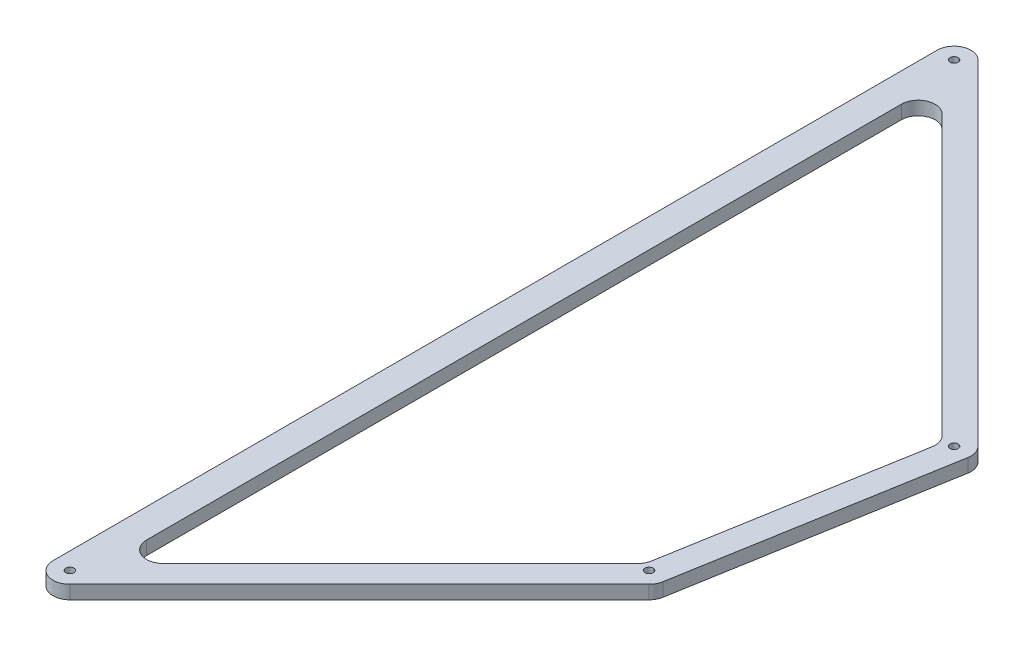
ISO-10303-21;
HEADER;
FILE_DESCRIPTION(('STEP AP214'),'2;1');
FILE_NAME('part.step','',(''),(''),'','','');
FILE_SCHEMA(('AUTOMOTIVE_DESIGN { 1 0 10303 214 1 1 1 1 }'));
ENDSEC;
DATA;
#1=APPLICATION_CONTEXT('core data for automotive mechanical design processes');
#2=APPLICATION_PROTOCOL_DEFINITION('international standard','automotive_design',2000,#1);
#3=PRODUCT_CONTEXT('',#1,'mechanical');
#4=PRODUCT('Part','Part','',(#3));
#5=PRODUCT_RELATED_PRODUCT_CATEGORY('part','',(#4));
#6=PRODUCT_DEFINITION_FORMATION('','',#4);
#7=PRODUCT_DEFINITION_CONTEXT('part definition',#1,'design');
#8=PRODUCT_DEFINITION('design','',#6,#7);
#9=PRODUCT_DEFINITION_SHAPE('','',#8);
#10=(LENGTH_UNIT() NAMED_UNIT(*) SI_UNIT(.MILLI.,.METRE.));
#11=(NAMED_UNIT(*) PLANE_ANGLE_UNIT() SI_UNIT($,.RADIAN.));
#12=(NAMED_UNIT(*) SI_UNIT($,.STERADIAN.) SOLID_ANGLE_UNIT());
#13=UNCERTAINTY_MEASURE_WITH_UNIT(LENGTH_MEASURE(1.E-05),#10,'distance_accuracy_value','');
#14=(GEOMETRIC_REPRESENTATION_CONTEXT(3) GLOBAL_UNCERTAINTY_ASSIGNED_CONTEXT((#13)) GLOBAL_UNIT_ASSIGNED_CONTEXT((#10,
#11,#12)) REPRESENTATION_CONTEXT('',''));
#15=CARTESIAN_POINT('',(0.,0.,0.));
#16=DIRECTION('',(0.,0.,1.));
#17=DIRECTION('',(1.,0.,0.));
#18=AXIS2_PLACEMENT_3D('',#15,#16,#17);
#19=CARTESIAN_POINT('',(62.7993789144051,2.54,-103.164221085596));
#20=DIRECTION('',(0.,-1.,0.));
#21=DIRECTION('',(0.,0.,-1.));
#22=AXIS2_PLACEMENT_3D('',#19,#20,#21);
#23=PLANE('',#22);
#24=CARTESIAN_POINT('',(0.,2.54,-165.9636));
#25=DIRECTION('',(0.,1.,0.));
#26=DIRECTION('',(0.,0.,1.));
#27=AXIS2_PLACEMENT_3D('',#24,#25,#26);
#28=CIRCLE('',#27,0.762000000000004);
#29=CARTESIAN_POINT('',(0.,2.54,-165.2016));
#30=VERTEX_POINT('',#29);
#31=EDGE_CURVE('E248',#30,#30,#28,.T.);
#32=ORIENTED_EDGE('',*,*,#31,.F.);
#33=EDGE_LOOP('',(#32));
#34=FACE_BOUND('',#33,.T.);
#35=CARTESIAN_POINT('',(62.7993789144051,2.54,-103.164221085596));
#36=DIRECTION('',(0.,1.,0.));
#37=DIRECTION('',(0.,0.,1.));
#38=AXIS2_PLACEMENT_3D('',#35,#36,#37);
#39=CIRCLE('',#38,0.762000000000003);
#40=CARTESIAN_POINT('',(62.7993789144051,2.54,-102.402221085596));
#41=VERTEX_POINT('',#40);
#42=EDGE_CURVE('E256',#41,#41,#39,.T.);
#43=ORIENTED_EDGE('',*,*,#42,.F.);
#44=EDGE_LOOP('',(#43));
#45=FACE_BOUND('',#44,.T.);
#46=CARTESIAN_POINT('',(54.3589141376759,2.54,-54.3589141376765));
#47=DIRECTION('',(0.,1.,0.));
#48=DIRECTION('',(0.,0.,1.));
#49=AXIS2_PLACEMENT_3D('',#46,#47,#48);
#50=CIRCLE('',#49,0.761999999999996);
#51=CARTESIAN_POINT('',(54.3589141376759,2.54,-53.5969141376765));
#52=VERTEX_POINT('',#51);
#53=EDGE_CURVE('E264',#52,#52,#50,.T.);
#54=ORIENTED_EDGE('',*,*,#53,.F.);
#55=EDGE_LOOP('',(#54));
#56=FACE_BOUND('',#55,.T.);
#57=CARTESIAN_POINT('',(0.,2.54,0.));
#58=DIRECTION('',(0.,1.,0.));
#59=DIRECTION('',(0.,0.,1.));
#60=AXIS2_PLACEMENT_3D('',#57,#58,#59);
#61=CIRCLE('',#60,0.762);
#62=CARTESIAN_POINT('',(0.,2.54,0.761999999999991));
#63=VERTEX_POINT('',#62);
#64=EDGE_CURVE('E272',#63,#63,#61,.T.);
#65=ORIENTED_EDGE('',*,*,#64,.F.);
#66=EDGE_LOOP('',(#65));
#67=FACE_BOUND('',#66,.T.);
#68=CARTESIAN_POINT('',(62.7993789144051,2.54,-103.164221085596));
#69=DIRECTION('',(0.,1.,0.));
#70=DIRECTION('',(0.,0.,-1.));
#71=AXIS2_PLACEMENT_3D('',#68,#69,#70);
#72=CIRCLE('',#71,3.17500000000003);
#73=CARTESIAN_POINT('',(65.9279379205785,2.54,-102.623163283793));
#74=VERTEX_POINT('',#73);
#75=CARTESIAN_POINT('',(65.0444429446724,2.54,-105.409285115863));
#76=VERTEX_POINT('',#75);
#77=EDGE_CURVE('E280',#74,#76,#72,.T.);
#78=ORIENTED_EDGE('',*,*,#77,.T.);
#79=DIRECTION('',(-0.707106781186552,0.,-0.707106781186543));
#80=VECTOR('',#79,1.);
#81=CARTESIAN_POINT('',(2.24506403026728,2.54,-168.208664030267));
#82=LINE('',#81,#80);
#83=CARTESIAN_POINT('',(2.24506403026728,2.54,-168.208664030267));
#84=VERTEX_POINT('',#83);
#85=EDGE_CURVE('E284',#76,#84,#82,.T.);
#86=ORIENTED_EDGE('',*,*,#85,.T.);
#87=CARTESIAN_POINT('',(0.,2.54,-165.9636));
#88=DIRECTION('',(0.,1.,0.));
#89=DIRECTION('',(0.,0.,-1.));
#90=AXIS2_PLACEMENT_3D('',#87,#88,#89);
#91=CIRCLE('',#90,3.175);
#92=CARTESIAN_POINT('',(-3.175,2.54,-165.9636));
#93=VERTEX_POINT('',#92);
#94=EDGE_CURVE('E288',#84,#93,#91,.T.);
#95=ORIENTED_EDGE('',*,*,#94,.T.);
#96=DIRECTION('',(0.,0.,1.));
#97=VECTOR('',#96,1.);
#98=CARTESIAN_POINT('',(-3.175,2.54,-165.9636));
#99=LINE('',#98,#97);
#100=CARTESIAN_POINT('',(-3.17499999999998,2.54,0.));
#101=VERTEX_POINT('',#100);
#102=EDGE_CURVE('E291',#93,#101,#99,.T.);
#103=ORIENTED_EDGE('',*,*,#102,.T.);
#104=CARTESIAN_POINT('',(0.,2.54,0.));
#105=DIRECTION('',(0.,1.,0.));
#106=DIRECTION('',(0.,0.,-1.));
#107=AXIS2_PLACEMENT_3D('',#104,#105,#106);
#108=CIRCLE('',#107,3.175);
#109=CARTESIAN_POINT('',(2.24506403026732,2.54,2.24506403026727));
#110=VERTEX_POINT('',#109);
#111=EDGE_CURVE('E294',#101,#110,#108,.T.);
#112=ORIENTED_EDGE('',*,*,#111,.T.);
#113=DIRECTION('',(0.707106781186544,0.,-0.707106781186551));
#114=VECTOR('',#113,1.);
#115=CARTESIAN_POINT('',(56.6039781679432,2.54,-52.1138501074092));
#116=LINE('',#115,#114);
#117=CARTESIAN_POINT('',(56.6039781679432,2.54,-52.1138501074092));
#118=VERTEX_POINT('',#117);
#119=EDGE_CURVE('E297',#110,#118,#116,.T.);
#120=ORIENTED_EDGE('',*,*,#119,.T.);
#121=CARTESIAN_POINT('',(54.3589141376759,2.54,-54.3589141376765));
#122=DIRECTION('',(0.,1.,0.));
#123=DIRECTION('',(0.,0.,-1.));
#124=AXIS2_PLACEMENT_3D('',#121,#122,#123);
#125=CIRCLE('',#124,3.17500000000001);
#126=CARTESIAN_POINT('',(57.4874731438493,2.54,-53.8178563358742));
#127=VERTEX_POINT('',#126);
#128=EDGE_CURVE('E300',#118,#127,#125,.T.);
#129=ORIENTED_EDGE('',*,*,#128,.T.);
#130=DIRECTION('',(0.170411906079453,0.,-0.985372915330215));
#131=VECTOR('',#130,1.);
#132=CARTESIAN_POINT('',(65.9279379205785,2.54,-102.623163283793));
#133=LINE('',#132,#131);
#134=EDGE_CURVE('E303',#127,#74,#133,.T.);
#135=ORIENTED_EDGE('',*,*,#134,.T.);
#136=EDGE_LOOP('',(#78,#86,#95,#103,#112,#120,#129,#135));
#137=FACE_BOUND('',#136,.T.);
#138=CARTESIAN_POINT('',(5.42006403026732,2.54,-12.1552561210693));
#139=DIRECTION('',(0.,1.,0.));
#140=DIRECTION('',(0.,0.,-1.));
#141=AXIS2_PLACEMENT_3D('',#138,#139,#140);
#142=CIRCLE('',#141,3.17500000000001);
#143=CARTESIAN_POINT('',(2.24506403026731,2.54,-12.1552561210693));
#144=VERTEX_POINT('',#143);
#145=CARTESIAN_POINT('',(7.66512806053461,2.54,-9.91019209080199));
#146=VERTEX_POINT('',#145);
#147=EDGE_CURVE('E159',#144,#146,#142,.T.);
#148=ORIENTED_EDGE('',*,*,#147,.F.);
#149=DIRECTION('',(0.,0.,1.));
#150=VECTOR('',#149,1.);
#151=CARTESIAN_POINT('',(2.2450640302673,2.54,-153.808343878931));
#152=LINE('',#151,#150);
#153=CARTESIAN_POINT('',(2.24506403026729,2.54,-153.808343878931));
#154=VERTEX_POINT('',#153);
#155=EDGE_CURVE('E200',#154,#144,#152,.T.);
#156=ORIENTED_EDGE('',*,*,#155,.F.);
#157=CARTESIAN_POINT('',(5.42006403026731,2.54,-153.808343878931));
#158=DIRECTION('',(0.,1.,0.));
#159=DIRECTION('',(0.,0.,-1.));
#160=AXIS2_PLACEMENT_3D('',#157,#158,#159);
#161=CIRCLE('',#160,3.17500000000003);
#162=CARTESIAN_POINT('',(7.66512806053458,2.54,-156.053407909198));
#163=VERTEX_POINT('',#162);
#164=EDGE_CURVE('E197',#163,#154,#161,.T.);
#165=ORIENTED_EDGE('',*,*,#164,.F.);
#166=DIRECTION('',(-0.707106781186551,0.,-0.707106781186544));
#167=VECTOR('',#166,1.);
#168=CARTESIAN_POINT('',(59.9308120918323,2.54,-103.787723877901));
#169=LINE('',#168,#167);
#170=CARTESIAN_POINT('',(59.9308120918323,2.54,-103.787723877901));
#171=VERTEX_POINT('',#170);
#172=EDGE_CURVE('E194',#171,#163,#169,.T.);
#173=ORIENTED_EDGE('',*,*,#172,.F.);
#174=CARTESIAN_POINT('',(57.685748061565,2.54,-101.542659847634));
#175=DIRECTION('',(0.,1.,0.));
#176=DIRECTION('',(0.,0.,1.));
#177=AXIS2_PLACEMENT_3D('',#174,#175,#176);
#178=CIRCLE('',#177,3.17500000000003);
#179=CARTESIAN_POINT('',(60.8143070677384,2.54,-101.001602045832));
#180=VERTEX_POINT('',#179);
#181=EDGE_CURVE('E191',#180,#171,#178,.T.);
#182=ORIENTED_EDGE('',*,*,#181,.F.);
#183=DIRECTION('',(0.170411906079453,0.,-0.985372915330215));
#184=VECTOR('',#183,1.);
#185=CARTESIAN_POINT('',(53.05199336388,2.54,-56.1175686467067));
#186=LINE('',#185,#184);
#187=CARTESIAN_POINT('',(53.05199336388,2.54,-56.1175686467067));
#188=VERTEX_POINT('',#187);
#189=EDGE_CURVE('E186',#188,#180,#186,.T.);
#190=ORIENTED_EDGE('',*,*,#189,.F.);
#191=CARTESIAN_POINT('',(49.9234343577065,2.54,-56.658626448509));
#192=DIRECTION('',(0.,1.,0.));
#193=DIRECTION('',(0.,0.,1.));
#194=AXIS2_PLACEMENT_3D('',#191,#192,#193);
#195=CIRCLE('',#194,3.17500000000001);
#196=CARTESIAN_POINT('',(52.1684983879738,2.54,-54.4135624182417));
#197=VERTEX_POINT('',#196);
#198=EDGE_CURVE('E182',#197,#188,#195,.T.);
#199=ORIENTED_EDGE('',*,*,#198,.F.);
#200=DIRECTION('',(0.707106781186544,0.,-0.707106781186551));
#201=VECTOR('',#200,1.);
#202=CARTESIAN_POINT('',(7.66512806053461,2.54,-9.91019209080199));
#203=LINE('',#202,#201);
#204=EDGE_CURVE('E168',#146,#197,#203,.T.);
#205=ORIENTED_EDGE('',*,*,#204,.F.);
#206=EDGE_LOOP('',(#148,#156,#165,#173,#182,#190,#199,#205));
#207=FACE_BOUND('',#206,.T.);
#208=ADVANCED_FACE('F45',(#34,#45,#56,#67,#137,#207),#23,.F.);
#209=CARTESIAN_POINT('',(62.7993789144051,0.,-103.164221085596));
#210=DIRECTION('',(0.,-1.,0.));
#211=DIRECTION('',(0.,0.,-1.));
#212=AXIS2_PLACEMENT_3D('',#209,#210,#211);
#213=PLANE('',#212);
#214=CARTESIAN_POINT('',(62.7993789144051,0.,-103.164221085596));
#215=DIRECTION('',(0.,1.,0.));
#216=DIRECTION('',(0.,0.,1.));
#217=AXIS2_PLACEMENT_3D('',#214,#215,#216);
#218=CIRCLE('',#217,0.762000000000003);
#219=CARTESIAN_POINT('',(62.7993789144051,0.,-102.402221085596));
#220=VERTEX_POINT('',#219);
#221=EDGE_CURVE('E252',#220,#220,#218,.T.);
#222=ORIENTED_EDGE('',*,*,#221,.T.);
#223=EDGE_LOOP('',(#222));
#224=FACE_BOUND('',#223,.T.);
#225=CARTESIAN_POINT('',(0.,0.,0.));
#226=DIRECTION('',(0.,1.,0.));
#227=DIRECTION('',(0.,0.,1.));
#228=AXIS2_PLACEMENT_3D('',#225,#226,#227);
#229=CIRCLE('',#228,0.762);
#230=CARTESIAN_POINT('',(0.,0.,0.761999999999991));
#231=VERTEX_POINT('',#230);
#232=EDGE_CURVE('E268',#231,#231,#229,.T.);
#233=ORIENTED_EDGE('',*,*,#232,.T.);
#234=EDGE_LOOP('',(#233));
#235=FACE_BOUND('',#234,.T.);
#236=CARTESIAN_POINT('',(62.7993789144051,0.,-103.164221085596));
#237=DIRECTION('',(0.,1.,0.));
#238=DIRECTION('',(0.,0.,-1.));
#239=AXIS2_PLACEMENT_3D('',#236,#237,#238);
#240=CIRCLE('',#239,3.17500000000003);
#241=CARTESIAN_POINT('',(65.9279379205785,0.,-102.623163283793));
#242=VERTEX_POINT('',#241);
#243=CARTESIAN_POINT('',(65.0444429446724,0.,-105.409285115863));
#244=VERTEX_POINT('',#243);
#245=EDGE_CURVE('E276',#242,#244,#240,.T.);
#246=ORIENTED_EDGE('',*,*,#245,.F.);
#247=DIRECTION('',(0.170411906079453,0.,-0.985372915330215));
#248=VECTOR('',#247,1.);
#249=CARTESIAN_POINT('',(65.9279379205785,0.,-102.623163283793));
#250=LINE('',#249,#248);
#251=CARTESIAN_POINT('',(57.4874731438493,0.,-53.8178563358742));
#252=VERTEX_POINT('',#251);
#253=EDGE_CURVE('E285',#252,#242,#250,.T.);
#254=ORIENTED_EDGE('',*,*,#253,.F.);
#255=CARTESIAN_POINT('',(54.3589141376759,0.,-54.3589141376765));
#256=DIRECTION('',(0.,1.,0.));
#257=DIRECTION('',(0.,0.,-1.));
#258=AXIS2_PLACEMENT_3D('',#255,#256,#257);
#259=CIRCLE('',#258,3.17500000000001);
#260=CARTESIAN_POINT('',(56.6039781679432,0.,-52.1138501074092));
#261=VERTEX_POINT('',#260);
#262=EDGE_CURVE('E325',#261,#252,#259,.T.);
#263=ORIENTED_EDGE('',*,*,#262,.F.);
#264=DIRECTION('',(0.707106781186544,0.,-0.707106781186551));
#265=VECTOR('',#264,1.);
#266=CARTESIAN_POINT('',(56.6039781679432,0.,-52.1138501074092));
#267=LINE('',#266,#265);
#268=CARTESIAN_POINT('',(2.24506403026732,0.,2.24506403026727));
#269=VERTEX_POINT('',#268);
#270=EDGE_CURVE('E322',#269,#261,#267,.T.);
#271=ORIENTED_EDGE('',*,*,#270,.F.);
#272=CARTESIAN_POINT('',(0.,0.,0.));
#273=DIRECTION('',(0.,1.,0.));
#274=DIRECTION('',(0.,0.,-1.));
#275=AXIS2_PLACEMENT_3D('',#272,#273,#274);
#276=CIRCLE('',#275,3.175);
#277=CARTESIAN_POINT('',(-3.17499999999998,0.,0.));
#278=VERTEX_POINT('',#277);
#279=EDGE_CURVE('E319',#278,#269,#276,.T.);
#280=ORIENTED_EDGE('',*,*,#279,.F.);
#281=DIRECTION('',(0.,0.,1.));
#282=VECTOR('',#281,1.);
#283=CARTESIAN_POINT('',(-3.175,0.,-165.9636));
#284=LINE('',#283,#282);
#285=CARTESIAN_POINT('',(-3.175,0.,-165.9636));
#286=VERTEX_POINT('',#285);
#287=EDGE_CURVE('E316',#286,#278,#284,.T.);
#288=ORIENTED_EDGE('',*,*,#287,.F.);
#289=CARTESIAN_POINT('',(0.,0.,-165.9636));
#290=DIRECTION('',(0.,1.,0.));
#291=DIRECTION('',(0.,0.,-1.));
#292=AXIS2_PLACEMENT_3D('',#289,#290,#291);
#293=CIRCLE('',#292,3.175);
#294=CARTESIAN_POINT('',(2.24506403026728,0.,-168.208664030267));
#295=VERTEX_POINT('',#294);
#296=EDGE_CURVE('E313',#295,#286,#293,.T.);
#297=ORIENTED_EDGE('',*,*,#296,.F.);
#298=DIRECTION('',(-0.707106781186552,0.,-0.707106781186543));
#299=VECTOR('',#298,1.);
#300=CARTESIAN_POINT('',(2.24506403026728,0.,-168.208664030267));
#301=LINE('',#300,#299);
#302=EDGE_CURVE('E310',#244,#295,#301,.T.);
#303=ORIENTED_EDGE('',*,*,#302,.F.);
#304=EDGE_LOOP('',(#246,#254,#263,#271,#280,#288,#297,#303));
#305=FACE_BOUND('',#304,.T.);
#306=CARTESIAN_POINT('',(54.3589141376759,0.,-54.3589141376765));
#307=DIRECTION('',(0.,1.,0.));
#308=DIRECTION('',(0.,0.,1.));
#309=AXIS2_PLACEMENT_3D('',#306,#307,#308);
#310=CIRCLE('',#309,0.761999999999996);
#311=CARTESIAN_POINT('',(54.3589141376759,0.,-53.5969141376765));
#312=VERTEX_POINT('',#311);
#313=EDGE_CURVE('E260',#312,#312,#310,.T.);
#314=ORIENTED_EDGE('',*,*,#313,.T.);
#315=EDGE_LOOP('',(#314));
#316=FACE_BOUND('',#315,.T.);
#317=CARTESIAN_POINT('',(0.,0.,-165.9636));
#318=DIRECTION('',(0.,1.,0.));
#319=DIRECTION('',(0.,0.,1.));
#320=AXIS2_PLACEMENT_3D('',#317,#318,#319);
#321=CIRCLE('',#320,0.762000000000004);
#322=CARTESIAN_POINT('',(0.,0.,-165.2016));
#323=VERTEX_POINT('',#322);
#324=EDGE_CURVE('E177',#323,#323,#321,.T.);
#325=ORIENTED_EDGE('',*,*,#324,.T.);
#326=EDGE_LOOP('',(#325));
#327=FACE_BOUND('',#326,.T.);
#328=DIRECTION('',(0.,0.,1.));
#329=VECTOR('',#328,1.);
#330=CARTESIAN_POINT('',(2.2450640302673,0.,-153.808343878931));
#331=LINE('',#330,#329);
#332=CARTESIAN_POINT('',(2.24506403026728,0.,-153.808343878931));
#333=VERTEX_POINT('',#332);
#334=CARTESIAN_POINT('',(2.24506403026731,0.,-12.1552561210693));
#335=VERTEX_POINT('',#334);
#336=EDGE_CURVE('E169',#333,#335,#331,.T.);
#337=ORIENTED_EDGE('',*,*,#336,.T.);
#338=CARTESIAN_POINT('',(5.42006403026732,0.,-12.1552561210693));
#339=DIRECTION('',(0.,1.,0.));
#340=DIRECTION('',(0.,0.,-1.));
#341=AXIS2_PLACEMENT_3D('',#338,#339,#340);
#342=CIRCLE('',#341,3.17500000000001);
#343=CARTESIAN_POINT('',(7.66512806053461,0.,-9.91019209080199));
#344=VERTEX_POINT('',#343);
#345=EDGE_CURVE('E69',#335,#344,#342,.T.);
#346=ORIENTED_EDGE('',*,*,#345,.T.);
#347=DIRECTION('',(0.707106781186544,0.,-0.707106781186551));
#348=VECTOR('',#347,1.);
#349=CARTESIAN_POINT('',(7.66512806053461,0.,-9.91019209080199));
#350=LINE('',#349,#348);
#351=CARTESIAN_POINT('',(52.1684983879738,0.,-54.4135624182417));
#352=VERTEX_POINT('',#351);
#353=EDGE_CURVE('E175',#344,#352,#350,.T.);
#354=ORIENTED_EDGE('',*,*,#353,.T.);
#355=CARTESIAN_POINT('',(49.9234343577065,0.,-56.658626448509));
#356=DIRECTION('',(0.,1.,0.));
#357=DIRECTION('',(0.,0.,1.));
#358=AXIS2_PLACEMENT_3D('',#355,#356,#357);
#359=CIRCLE('',#358,3.17500000000001);
#360=CARTESIAN_POINT('',(53.05199336388,0.,-56.1175686467067));
#361=VERTEX_POINT('',#360);
#362=EDGE_CURVE('E207',#352,#361,#359,.T.);
#363=ORIENTED_EDGE('',*,*,#362,.T.);
#364=DIRECTION('',(0.170411906079453,0.,-0.985372915330215));
#365=VECTOR('',#364,1.);
#366=CARTESIAN_POINT('',(53.05199336388,0.,-56.1175686467067));
#367=LINE('',#366,#365);
#368=CARTESIAN_POINT('',(60.8143070677384,0.,-101.001602045832));
#369=VERTEX_POINT('',#368);
#370=EDGE_CURVE('E211',#361,#369,#367,.T.);
#371=ORIENTED_EDGE('',*,*,#370,.T.);
#372=CARTESIAN_POINT('',(57.685748061565,0.,-101.542659847634));
#373=DIRECTION('',(0.,1.,0.));
#374=DIRECTION('',(0.,0.,1.));
#375=AXIS2_PLACEMENT_3D('',#372,#373,#374);
#376=CIRCLE('',#375,3.17500000000003);
#377=CARTESIAN_POINT('',(59.9308120918323,0.,-103.787723877901));
#378=VERTEX_POINT('',#377);
#379=EDGE_CURVE('E215',#369,#378,#376,.T.);
#380=ORIENTED_EDGE('',*,*,#379,.T.);
#381=DIRECTION('',(-0.707106781186551,0.,-0.707106781186544));
#382=VECTOR('',#381,1.);
#383=CARTESIAN_POINT('',(59.9308120918323,0.,-103.787723877901));
#384=LINE('',#383,#382);
#385=CARTESIAN_POINT('',(7.66512806053458,0.,-156.053407909198));
#386=VERTEX_POINT('',#385);
#387=EDGE_CURVE('E219',#378,#386,#384,.T.);
#388=ORIENTED_EDGE('',*,*,#387,.T.);
#389=CARTESIAN_POINT('',(5.42006403026731,0.,-153.808343878931));
#390=DIRECTION('',(0.,1.,0.));
#391=DIRECTION('',(0.,0.,-1.));
#392=AXIS2_PLACEMENT_3D('',#389,#390,#391);
#393=CIRCLE('',#392,3.17500000000003);
#394=EDGE_CURVE('E223',#386,#333,#393,.T.);
#395=ORIENTED_EDGE('',*,*,#394,.T.);
#396=EDGE_LOOP('',(#337,#346,#354,#363,#371,#380,#388,#395));
#397=FACE_BOUND('',#396,.T.);
#398=ADVANCED_FACE('F364',(#224,#235,#305,#316,#327,#397),#213,.T.);
#399=CARTESIAN_POINT('',(62.7993789144051,2.54,-103.164221085596));
#400=DIRECTION('',(0.,-1.,0.));
#401=DIRECTION('',(0.,0.,-1.));
#402=AXIS2_PLACEMENT_3D('',#399,#400,#401);
#403=CYLINDRICAL_SURFACE('',#402,3.17500000000003);
#404=ORIENTED_EDGE('',*,*,#245,.T.);
#405=DIRECTION('',(0.,-1.,0.));
#406=VECTOR('',#405,1.);
#407=CARTESIAN_POINT('',(65.0444429446724,2.54,-105.409285115863));
#408=LINE('',#407,#406);
#409=EDGE_CURVE('E11',#76,#244,#408,.T.);
#410=ORIENTED_EDGE('',*,*,#409,.F.);
#411=ORIENTED_EDGE('',*,*,#77,.F.);
#412=DIRECTION('',(0.,-1.,0.));
#413=VECTOR('',#412,1.);
#414=CARTESIAN_POINT('',(65.9279379205785,2.54,-102.623163283793));
#415=LINE('',#414,#413);
#416=EDGE_CURVE('E306',#74,#242,#415,.T.);
#417=ORIENTED_EDGE('',*,*,#416,.T.);
#418=EDGE_LOOP('',(#404,#410,#411,#417));
#419=FACE_BOUND('',#418,.T.);
#420=ADVANCED_FACE('F47',(#419),#403,.T.);
#421=CARTESIAN_POINT('',(2.24506403026728,2.54,-168.208664030267));
#422=DIRECTION('',(-0.707106781186543,0.,0.707106781186552));
#423=DIRECTION('',(0.707106781186552,0.,0.707106781186543));
#424=AXIS2_PLACEMENT_3D('',#421,#422,#423);
#425=PLANE('',#424);
#426=ORIENTED_EDGE('',*,*,#302,.T.);
#427=DIRECTION('',(0.,-1.,0.));
#428=VECTOR('',#427,1.);
#429=CARTESIAN_POINT('',(2.24506403026728,2.54,-168.208664030267));
#430=LINE('',#429,#428);
#431=EDGE_CURVE('E54',#84,#295,#430,.T.);
#432=ORIENTED_EDGE('',*,*,#431,.F.);
#433=ORIENTED_EDGE('',*,*,#85,.F.);
#434=ORIENTED_EDGE('',*,*,#409,.T.);
#435=EDGE_LOOP('',(#426,#432,#433,#434));
#436=FACE_BOUND('',#435,.T.);
#437=ADVANCED_FACE('F381',(#436),#425,.F.);
#438=CARTESIAN_POINT('',(0.,2.54,-165.9636));
#439=DIRECTION('',(0.,-1.,0.));
#440=DIRECTION('',(0.,0.,-1.));
#441=AXIS2_PLACEMENT_3D('',#438,#439,#440);
#442=CYLINDRICAL_SURFACE('',#441,3.175);
#443=ORIENTED_EDGE('',*,*,#296,.T.);
#444=DIRECTION('',(0.,-1.,0.));
#445=VECTOR('',#444,1.);
#446=CARTESIAN_POINT('',(-3.175,2.54,-165.9636));
#447=LINE('',#446,#445);
#448=EDGE_CURVE('E349',#93,#286,#447,.T.);
#449=ORIENTED_EDGE('',*,*,#448,.F.);
#450=ORIENTED_EDGE('',*,*,#94,.F.);
#451=ORIENTED_EDGE('',*,*,#431,.T.);
#452=EDGE_LOOP('',(#443,#449,#450,#451));
#453=FACE_BOUND('',#452,.T.);
#454=ADVANCED_FACE('F358',(#453),#442,.T.);
#455=CARTESIAN_POINT('',(-3.175,2.54,-165.9636));
#456=DIRECTION('',(1.,0.,0.));
#457=DIRECTION('',(0.,0.,-1.));
#458=AXIS2_PLACEMENT_3D('',#455,#456,#457);
#459=PLANE('',#458);
#460=ORIENTED_EDGE('',*,*,#287,.T.);
#461=DIRECTION('',(0.,-1.,0.));
#462=VECTOR('',#461,1.);
#463=CARTESIAN_POINT('',(-3.17499999999998,2.54,0.));
#464=LINE('',#463,#462);
#465=EDGE_CURVE('E345',#101,#278,#464,.T.);
#466=ORIENTED_EDGE('',*,*,#465,.F.);
#467=ORIENTED_EDGE('',*,*,#102,.F.);
#468=ORIENTED_EDGE('',*,*,#448,.T.);
#469=EDGE_LOOP('',(#460,#466,#467,#468));
#470=FACE_BOUND('',#469,.T.);
#471=ADVANCED_FACE('F370',(#470),#459,.F.);
#472=CARTESIAN_POINT('',(0.,2.54,0.));
#473=DIRECTION('',(0.,-1.,0.));
#474=DIRECTION('',(0.,0.,-1.));
#475=AXIS2_PLACEMENT_3D('',#472,#473,#474);
#476=CYLINDRICAL_SURFACE('',#475,3.175);
#477=ORIENTED_EDGE('',*,*,#279,.T.);
#478=DIRECTION('',(0.,-1.,0.));
#479=VECTOR('',#478,1.);
#480=CARTESIAN_POINT('',(2.24506403026732,2.54,2.24506403026727));
#481=LINE('',#480,#479);
#482=EDGE_CURVE('E341',#110,#269,#481,.T.);
#483=ORIENTED_EDGE('',*,*,#482,.F.);
#484=ORIENTED_EDGE('',*,*,#111,.F.);
#485=ORIENTED_EDGE('',*,*,#465,.T.);
#486=EDGE_LOOP('',(#477,#483,#484,#485));
#487=FACE_BOUND('',#486,.T.);
#488=ADVANCED_FACE('F374',(#487),#476,.T.);
#489=CARTESIAN_POINT('',(56.6039781679432,2.54,-52.1138501074092));
#490=DIRECTION('',(-0.707106781186551,0.,-0.707106781186544));
#491=DIRECTION('',(-0.707106781186544,0.,0.707106781186551));
#492=AXIS2_PLACEMENT_3D('',#489,#490,#491);
#493=PLANE('',#492);
#494=ORIENTED_EDGE('',*,*,#270,.T.);
#495=DIRECTION('',(0.,-1.,0.));
#496=VECTOR('',#495,1.);
#497=CARTESIAN_POINT('',(56.6039781679432,2.54,-52.1138501074092));
#498=LINE('',#497,#496);
#499=EDGE_CURVE('E337',#118,#261,#498,.T.);
#500=ORIENTED_EDGE('',*,*,#499,.F.);
#501=ORIENTED_EDGE('',*,*,#119,.F.);
#502=ORIENTED_EDGE('',*,*,#482,.T.);
#503=EDGE_LOOP('',(#494,#500,#501,#502));
#504=FACE_BOUND('',#503,.T.);
#505=ADVANCED_FACE('F394',(#504),#493,.F.);
#506=CARTESIAN_POINT('',(54.3589141376759,2.54,-54.3589141376765));
#507=DIRECTION('',(0.,-1.,0.));
#508=DIRECTION('',(0.,0.,-1.));
#509=AXIS2_PLACEMENT_3D('',#506,#507,#508);
#510=CYLINDRICAL_SURFACE('',#509,3.17500000000001);
#511=ORIENTED_EDGE('',*,*,#262,.T.);
#512=DIRECTION('',(0.,-1.,0.));
#513=VECTOR('',#512,1.);
#514=CARTESIAN_POINT('',(57.4874731438493,2.54,-53.8178563358742));
#515=LINE('',#514,#513);
#516=EDGE_CURVE('E333',#127,#252,#515,.T.);
#517=ORIENTED_EDGE('',*,*,#516,.F.);
#518=ORIENTED_EDGE('',*,*,#128,.F.);
#519=ORIENTED_EDGE('',*,*,#499,.T.);
#520=EDGE_LOOP('',(#511,#517,#518,#519));
#521=FACE_BOUND('',#520,.T.);
#522=ADVANCED_FACE('F392',(#521),#510,.T.);
#523=CARTESIAN_POINT('',(65.9279379205785,2.54,-102.623163283793));
#524=DIRECTION('',(-0.985372915330215,0.,-0.170411906079453));
#525=DIRECTION('',(-0.170411906079453,0.,0.985372915330215));
#526=AXIS2_PLACEMENT_3D('',#523,#524,#525);
#527=PLANE('',#526);
#528=ORIENTED_EDGE('',*,*,#253,.T.);
#529=ORIENTED_EDGE('',*,*,#416,.F.);
#530=ORIENTED_EDGE('',*,*,#134,.F.);
#531=ORIENTED_EDGE('',*,*,#516,.T.);
#532=EDGE_LOOP('',(#528,#529,#530,#531));
#533=FACE_BOUND('',#532,.T.);
#534=ADVANCED_FACE('F387',(#533),#527,.F.);
#535=CARTESIAN_POINT('',(0.,2.54,0.));
#536=DIRECTION('',(0.,-1.,0.));
#537=DIRECTION('',(0.,0.,-1.));
#538=AXIS2_PLACEMENT_3D('',#535,#536,#537);
#539=CYLINDRICAL_SURFACE('',#538,0.762);
#540=ORIENTED_EDGE('',*,*,#64,.T.);
#541=EDGE_LOOP('',(#540));
#542=FACE_BOUND('',#541,.T.);
#543=ORIENTED_EDGE('',*,*,#232,.F.);
#544=EDGE_LOOP('',(#543));
#545=FACE_BOUND('',#544,.T.);
#546=ADVANCED_FACE('F414',(#542,#545),#539,.F.);
#547=CARTESIAN_POINT('',(54.3589141376759,2.54,-54.3589141376765));
#548=DIRECTION('',(0.,-1.,0.));
#549=DIRECTION('',(0.,0.,-1.));
#550=AXIS2_PLACEMENT_3D('',#547,#548,#549);
#551=CYLINDRICAL_SURFACE('',#550,0.761999999999996);
#552=ORIENTED_EDGE('',*,*,#53,.T.);
#553=EDGE_LOOP('',(#552));
#554=FACE_BOUND('',#553,.T.);
#555=ORIENTED_EDGE('',*,*,#313,.F.);
#556=EDGE_LOOP('',(#555));
#557=FACE_BOUND('',#556,.T.);
#558=ADVANCED_FACE('F421',(#554,#557),#551,.F.);
#559=CARTESIAN_POINT('',(62.7993789144051,2.54,-103.164221085596));
#560=DIRECTION('',(0.,-1.,0.));
#561=DIRECTION('',(0.,0.,-1.));
#562=AXIS2_PLACEMENT_3D('',#559,#560,#561);
#563=CYLINDRICAL_SURFACE('',#562,0.762000000000003);
#564=ORIENTED_EDGE('',*,*,#42,.T.);
#565=EDGE_LOOP('',(#564));
#566=FACE_BOUND('',#565,.T.);
#567=ORIENTED_EDGE('',*,*,#221,.F.);
#568=EDGE_LOOP('',(#567));
#569=FACE_BOUND('',#568,.T.);
#570=ADVANCED_FACE('F426',(#566,#569),#563,.F.);
#571=CARTESIAN_POINT('',(0.,2.54,-165.9636));
#572=DIRECTION('',(0.,-1.,0.));
#573=DIRECTION('',(0.,0.,-1.));
#574=AXIS2_PLACEMENT_3D('',#571,#572,#573);
#575=CYLINDRICAL_SURFACE('',#574,0.762000000000004);
#576=ORIENTED_EDGE('',*,*,#31,.T.);
#577=EDGE_LOOP('',(#576));
#578=FACE_BOUND('',#577,.T.);
#579=ORIENTED_EDGE('',*,*,#324,.F.);
#580=EDGE_LOOP('',(#579));
#581=FACE_BOUND('',#580,.T.);
#582=ADVANCED_FACE('F436',(#578,#581),#575,.F.);
#583=CARTESIAN_POINT('',(5.42006403026732,2.54,-12.1552561210693));
#584=DIRECTION('',(0.,-1.,0.));
#585=DIRECTION('',(0.,0.,-1.));
#586=AXIS2_PLACEMENT_3D('',#583,#584,#585);
#587=CYLINDRICAL_SURFACE('',#586,3.17500000000001);
#588=ORIENTED_EDGE('',*,*,#345,.F.);
#589=DIRECTION('',(0.,-1.,0.));
#590=VECTOR('',#589,1.);
#591=CARTESIAN_POINT('',(2.24506403026731,2.54,-12.1552561210693));
#592=LINE('',#591,#590);
#593=EDGE_CURVE('E163',#144,#335,#592,.T.);
#594=ORIENTED_EDGE('',*,*,#593,.F.);
#595=ORIENTED_EDGE('',*,*,#147,.T.);
#596=DIRECTION('',(0.,-1.,0.));
#597=VECTOR('',#596,1.);
#598=CARTESIAN_POINT('',(7.66512806053461,2.54,-9.91019209080199));
#599=LINE('',#598,#597);
#600=EDGE_CURVE('E162',#146,#344,#599,.T.);
#601=ORIENTED_EDGE('',*,*,#600,.T.);
#602=EDGE_LOOP('',(#588,#594,#595,#601));
#603=FACE_BOUND('',#602,.T.);
#604=ADVANCED_FACE('F161',(#603),#587,.F.);
#605=CARTESIAN_POINT('',(7.66512806053461,2.54,-9.91019209080199));
#606=DIRECTION('',(-0.707106781186551,0.,-0.707106781186544));
#607=DIRECTION('',(-0.707106781186544,0.,0.707106781186551));
#608=AXIS2_PLACEMENT_3D('',#605,#606,#607);
#609=PLANE('',#608);
#610=ORIENTED_EDGE('',*,*,#353,.F.);
#611=ORIENTED_EDGE('',*,*,#600,.F.);
#612=ORIENTED_EDGE('',*,*,#204,.T.);
#613=DIRECTION('',(0.,-1.,0.));
#614=VECTOR('',#613,1.);
#615=CARTESIAN_POINT('',(52.1684983879738,2.54,-54.4135624182417));
#616=LINE('',#615,#614);
#617=EDGE_CURVE('E178',#197,#352,#616,.T.);
#618=ORIENTED_EDGE('',*,*,#617,.T.);
#619=EDGE_LOOP('',(#610,#611,#612,#618));
#620=FACE_BOUND('',#619,.T.);
#621=ADVANCED_FACE('F172',(#620),#609,.T.);
#622=CARTESIAN_POINT('',(49.9234343577065,2.54,-56.658626448509));
#623=DIRECTION('',(0.,-1.,0.));
#624=DIRECTION('',(0.,0.,-1.));
#625=AXIS2_PLACEMENT_3D('',#622,#623,#624);
#626=CYLINDRICAL_SURFACE('',#625,3.17500000000001);
#627=ORIENTED_EDGE('',*,*,#362,.F.);
#628=ORIENTED_EDGE('',*,*,#617,.F.);
#629=ORIENTED_EDGE('',*,*,#198,.T.);
#630=DIRECTION('',(0.,-1.,0.));
#631=VECTOR('',#630,1.);
#632=CARTESIAN_POINT('',(53.05199336388,2.54,-56.1175686467067));
#633=LINE('',#632,#631);
#634=EDGE_CURVE('E243',#188,#361,#633,.T.);
#635=ORIENTED_EDGE('',*,*,#634,.T.);
#636=EDGE_LOOP('',(#627,#628,#629,#635));
#637=FACE_BOUND('',#636,.T.);
#638=ADVANCED_FACE('F448',(#637),#626,.F.);
#639=CARTESIAN_POINT('',(53.05199336388,2.54,-56.1175686467067));
#640=DIRECTION('',(-0.985372915330215,0.,-0.170411906079453));
#641=DIRECTION('',(-0.170411906079453,0.,0.985372915330215));
#642=AXIS2_PLACEMENT_3D('',#639,#640,#641);
#643=PLANE('',#642);
#644=ORIENTED_EDGE('',*,*,#370,.F.);
#645=ORIENTED_EDGE('',*,*,#634,.F.);
#646=ORIENTED_EDGE('',*,*,#189,.T.);
#647=DIRECTION('',(0.,-1.,0.));
#648=VECTOR('',#647,1.);
#649=CARTESIAN_POINT('',(60.8143070677384,2.54,-101.001602045832));
#650=LINE('',#649,#648);
#651=EDGE_CURVE('E240',#180,#369,#650,.T.);
#652=ORIENTED_EDGE('',*,*,#651,.T.);
#653=EDGE_LOOP('',(#644,#645,#646,#652));
#654=FACE_BOUND('',#653,.T.);
#655=ADVANCED_FACE('F451',(#654),#643,.T.);
#656=CARTESIAN_POINT('',(57.685748061565,2.54,-101.542659847634));
#657=DIRECTION('',(0.,-1.,0.));
#658=DIRECTION('',(0.,0.,-1.));
#659=AXIS2_PLACEMENT_3D('',#656,#657,#658);
#660=CYLINDRICAL_SURFACE('',#659,3.17500000000003);
#661=ORIENTED_EDGE('',*,*,#379,.F.);
#662=ORIENTED_EDGE('',*,*,#651,.F.);
#663=ORIENTED_EDGE('',*,*,#181,.T.);
#664=DIRECTION('',(0.,-1.,0.));
#665=VECTOR('',#664,1.);
#666=CARTESIAN_POINT('',(59.9308120918323,2.54,-103.787723877901));
#667=LINE('',#666,#665);
#668=EDGE_CURVE('E237',#171,#378,#667,.T.);
#669=ORIENTED_EDGE('',*,*,#668,.T.);
#670=EDGE_LOOP('',(#661,#662,#663,#669));
#671=FACE_BOUND('',#670,.T.);
#672=ADVANCED_FACE('F455',(#671),#660,.F.);
#673=CARTESIAN_POINT('',(59.9308120918323,2.54,-103.787723877901));
#674=DIRECTION('',(-0.707106781186544,0.,0.707106781186551));
#675=DIRECTION('',(0.707106781186551,0.,0.707106781186544));
#676=AXIS2_PLACEMENT_3D('',#673,#674,#675);
#677=PLANE('',#676);
#678=ORIENTED_EDGE('',*,*,#387,.F.);
#679=ORIENTED_EDGE('',*,*,#668,.F.);
#680=ORIENTED_EDGE('',*,*,#172,.T.);
#681=DIRECTION('',(0.,-1.,0.));
#682=VECTOR('',#681,1.);
#683=CARTESIAN_POINT('',(7.66512806053458,2.54,-156.053407909198));
#684=LINE('',#683,#682);
#685=EDGE_CURVE('E234',#163,#386,#684,.T.);
#686=ORIENTED_EDGE('',*,*,#685,.T.);
#687=EDGE_LOOP('',(#678,#679,#680,#686));
#688=FACE_BOUND('',#687,.T.);
#689=ADVANCED_FACE('F459',(#688),#677,.T.);
#690=CARTESIAN_POINT('',(5.42006403026731,2.54,-153.808343878931));
#691=DIRECTION('',(0.,-1.,0.));
#692=DIRECTION('',(0.,0.,-1.));
#693=AXIS2_PLACEMENT_3D('',#690,#691,#692);
#694=CYLINDRICAL_SURFACE('',#693,3.17500000000003);
#695=ORIENTED_EDGE('',*,*,#394,.F.);
#696=ORIENTED_EDGE('',*,*,#685,.F.);
#697=ORIENTED_EDGE('',*,*,#164,.T.);
#698=DIRECTION('',(0.,-1.,0.));
#699=VECTOR('',#698,1.);
#700=CARTESIAN_POINT('',(2.24506403026728,2.54,-153.808343878931));
#701=LINE('',#700,#699);
#702=EDGE_CURVE('E61',#154,#333,#701,.T.);
#703=ORIENTED_EDGE('',*,*,#702,.T.);
#704=EDGE_LOOP('',(#695,#696,#697,#703));
#705=FACE_BOUND('',#704,.T.);
#706=ADVANCED_FACE('F463',(#705),#694,.F.);
#707=CARTESIAN_POINT('',(2.2450640302673,2.54,-153.808343878931));
#708=DIRECTION('',(1.,0.,0.));
#709=DIRECTION('',(0.,0.,-1.));
#710=AXIS2_PLACEMENT_3D('',#707,#708,#709);
#711=PLANE('',#710);
#712=ORIENTED_EDGE('',*,*,#336,.F.);
#713=ORIENTED_EDGE('',*,*,#702,.F.);
#714=ORIENTED_EDGE('',*,*,#155,.T.);
#715=ORIENTED_EDGE('',*,*,#593,.T.);
#716=EDGE_LOOP('',(#712,#713,#714,#715));
#717=FACE_BOUND('',#716,.T.);
#718=ADVANCED_FACE('F467',(#717),#711,.T.);
#719=CLOSED_SHELL('',(#208,#398,#420,#437,#454,#471,#488,#505,#522,#534,#546,#558,#570,#582,
#604,#621,#638,#655,#672,#689,#706,#718));
#720=MANIFOLD_SOLID_BREP('B2',#719);
#721=ADVANCED_BREP_SHAPE_REPRESENTATION('',(#18,#720),#14);
#722=SHAPE_DEFINITION_REPRESENTATION(#9,#721);
ENDSEC;
END-ISO-10303-21;
